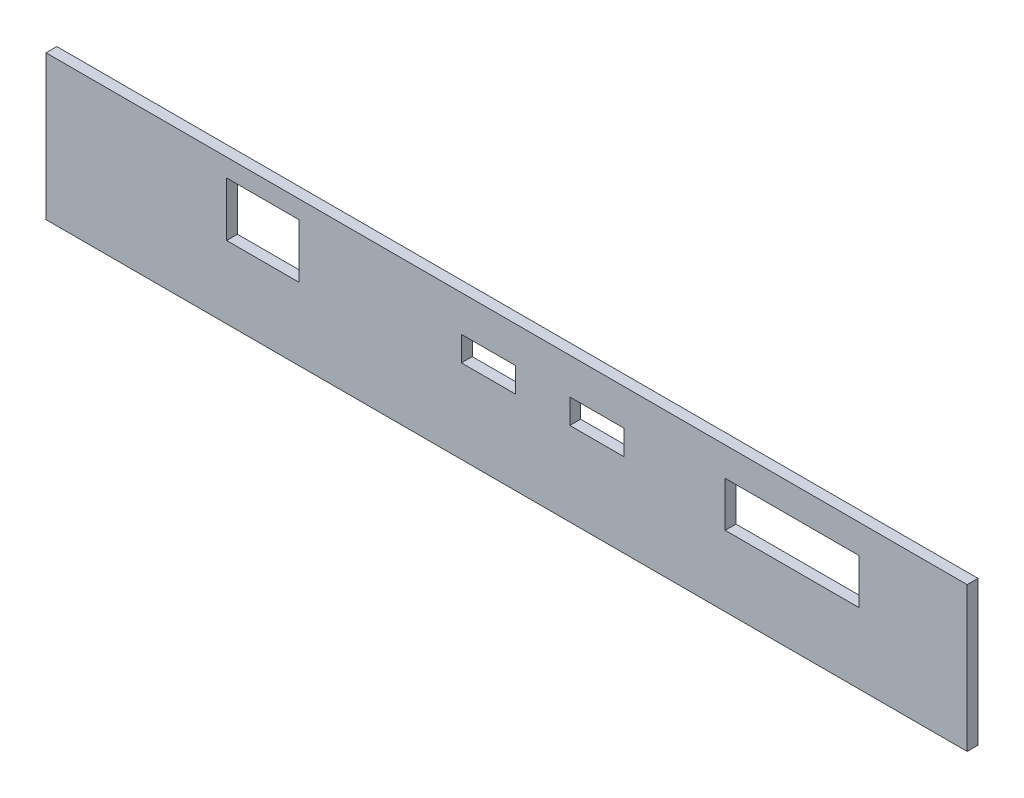
ISO-10303-21;
HEADER;
FILE_DESCRIPTION(('STEP AP214'),'2;1');
FILE_NAME('part.step','',(''),(''),'','','');
FILE_SCHEMA(('AUTOMOTIVE_DESIGN { 1 0 10303 214 1 1 1 1 }'));
ENDSEC;
DATA;
#1=APPLICATION_CONTEXT('core data for automotive mechanical design processes');
#2=APPLICATION_PROTOCOL_DEFINITION('international standard','automotive_design',2000,#1);
#3=PRODUCT_CONTEXT('',#1,'mechanical');
#4=PRODUCT('Part','Part','',(#3));
#5=PRODUCT_RELATED_PRODUCT_CATEGORY('part','',(#4));
#6=PRODUCT_DEFINITION_FORMATION('','',#4);
#7=PRODUCT_DEFINITION_CONTEXT('part definition',#1,'design');
#8=PRODUCT_DEFINITION('design','',#6,#7);
#9=PRODUCT_DEFINITION_SHAPE('','',#8);
#10=(LENGTH_UNIT() NAMED_UNIT(*) SI_UNIT(.MILLI.,.METRE.));
#11=(NAMED_UNIT(*) PLANE_ANGLE_UNIT() SI_UNIT($,.RADIAN.));
#12=(NAMED_UNIT(*) SI_UNIT($,.STERADIAN.) SOLID_ANGLE_UNIT());
#13=UNCERTAINTY_MEASURE_WITH_UNIT(LENGTH_MEASURE(1.E-05),#10,'distance_accuracy_value','');
#14=(GEOMETRIC_REPRESENTATION_CONTEXT(3) GLOBAL_UNCERTAINTY_ASSIGNED_CONTEXT((#13)) GLOBAL_UNIT_ASSIGNED_CONTEXT((#10,
#11,#12)) REPRESENTATION_CONTEXT('',''));
#15=CARTESIAN_POINT('',(0.,0.,0.));
#16=DIRECTION('',(0.,0.,1.));
#17=DIRECTION('',(1.,0.,0.));
#18=AXIS2_PLACEMENT_3D('',#15,#16,#17);
#19=CARTESIAN_POINT('',(-72.2716231344216,0.,3.));
#20=DIRECTION('',(1.,0.,0.));
#21=DIRECTION('',(0.,0.,-1.));
#22=AXIS2_PLACEMENT_3D('',#19,#20,#21);
#23=PLANE('',#22);
#24=DIRECTION('',(0.,-1.,0.));
#25=VECTOR('',#24,1.);
#26=CARTESIAN_POINT('',(-72.2716231344216,0.,0.));
#27=LINE('',#26,#25);
#28=CARTESIAN_POINT('',(-72.2716231344216,9.64684014869885,0.));
#29=VERTEX_POINT('',#28);
#30=CARTESIAN_POINT('',(-72.2716231344216,-5.35315985130115,0.));
#31=VERTEX_POINT('',#30);
#32=EDGE_CURVE('E298',#29,#31,#27,.T.);
#33=ORIENTED_EDGE('',*,*,#32,.F.);
#34=DIRECTION('',(0.,0.,-1.));
#35=VECTOR('',#34,1.);
#36=CARTESIAN_POINT('',(-72.2716231344216,9.64684014869885,3.));
#37=LINE('',#36,#35);
#38=CARTESIAN_POINT('',(-72.2716231344216,9.64684014869885,3.));
#39=VERTEX_POINT('',#38);
#40=EDGE_CURVE('E11',#39,#29,#37,.T.);
#41=ORIENTED_EDGE('',*,*,#40,.F.);
#42=DIRECTION('',(0.,-1.,0.));
#43=VECTOR('',#42,1.);
#44=CARTESIAN_POINT('',(-72.2716231344216,0.,3.));
#45=LINE('',#44,#43);
#46=CARTESIAN_POINT('',(-72.2716231344216,-5.35315985130115,3.));
#47=VERTEX_POINT('',#46);
#48=EDGE_CURVE('E191',#39,#47,#45,.T.);
#49=ORIENTED_EDGE('',*,*,#48,.T.);
#50=DIRECTION('',(0.,0.,-1.));
#51=VECTOR('',#50,1.);
#52=CARTESIAN_POINT('',(-72.2716231344216,-5.35315985130115,3.));
#53=LINE('',#52,#51);
#54=EDGE_CURVE('E53',#47,#31,#53,.T.);
#55=ORIENTED_EDGE('',*,*,#54,.T.);
#56=EDGE_LOOP('',(#33,#41,#49,#55));
#57=FACE_BOUND('',#56,.T.);
#58=ADVANCED_FACE('F34',(#57),#23,.T.);
#59=CARTESIAN_POINT('',(0.,9.64684014869885,3.));
#60=DIRECTION('',(0.,1.,0.));
#61=DIRECTION('',(0.,0.,1.));
#62=AXIS2_PLACEMENT_3D('',#59,#60,#61);
#63=PLANE('',#62);
#64=DIRECTION('',(1.,0.,0.));
#65=VECTOR('',#64,1.);
#66=CARTESIAN_POINT('',(0.,9.64684014869885,0.));
#67=LINE('',#66,#65);
#68=CARTESIAN_POINT('',(-52.2716231344216,9.64684014869885,0.));
#69=VERTEX_POINT('',#68);
#70=EDGE_CURVE('E196',#29,#69,#67,.T.);
#71=ORIENTED_EDGE('',*,*,#70,.T.);
#72=DIRECTION('',(0.,0.,-1.));
#73=VECTOR('',#72,1.);
#74=CARTESIAN_POINT('',(-52.2716231344216,9.64684014869885,3.));
#75=LINE('',#74,#73);
#76=CARTESIAN_POINT('',(-52.2716231344216,9.64684014869885,3.));
#77=VERTEX_POINT('',#76);
#78=EDGE_CURVE('E44',#77,#69,#75,.T.);
#79=ORIENTED_EDGE('',*,*,#78,.F.);
#80=DIRECTION('',(1.,0.,0.));
#81=VECTOR('',#80,1.);
#82=CARTESIAN_POINT('',(0.,9.64684014869885,3.));
#83=LINE('',#82,#81);
#84=EDGE_CURVE('E186',#39,#77,#83,.T.);
#85=ORIENTED_EDGE('',*,*,#84,.F.);
#86=ORIENTED_EDGE('',*,*,#40,.T.);
#87=EDGE_LOOP('',(#71,#79,#85,#86));
#88=FACE_BOUND('',#87,.T.);
#89=ADVANCED_FACE('F194',(#88),#63,.F.);
#90=CARTESIAN_POINT('',(-52.2716231344216,0.,3.));
#91=DIRECTION('',(1.,0.,0.));
#92=DIRECTION('',(0.,0.,-1.));
#93=AXIS2_PLACEMENT_3D('',#90,#91,#92);
#94=PLANE('',#93);
#95=DIRECTION('',(0.,-1.,0.));
#96=VECTOR('',#95,1.);
#97=CARTESIAN_POINT('',(-52.2716231344216,0.,0.));
#98=LINE('',#97,#96);
#99=CARTESIAN_POINT('',(-52.2716231344216,-5.35315985130115,0.));
#100=VERTEX_POINT('',#99);
#101=EDGE_CURVE('E301',#69,#100,#98,.T.);
#102=ORIENTED_EDGE('',*,*,#101,.T.);
#103=DIRECTION('',(0.,0.,-1.));
#104=VECTOR('',#103,1.);
#105=CARTESIAN_POINT('',(-52.2716231344216,-5.35315985130115,3.));
#106=LINE('',#105,#104);
#107=CARTESIAN_POINT('',(-52.2716231344216,-5.35315985130115,3.));
#108=VERTEX_POINT('',#107);
#109=EDGE_CURVE('E115',#108,#100,#106,.T.);
#110=ORIENTED_EDGE('',*,*,#109,.F.);
#111=DIRECTION('',(0.,-1.,0.));
#112=VECTOR('',#111,1.);
#113=CARTESIAN_POINT('',(-52.2716231344216,0.,3.));
#114=LINE('',#113,#112);
#115=EDGE_CURVE('E178',#77,#108,#114,.T.);
#116=ORIENTED_EDGE('',*,*,#115,.F.);
#117=ORIENTED_EDGE('',*,*,#78,.T.);
#118=EDGE_LOOP('',(#102,#110,#116,#117));
#119=FACE_BOUND('',#118,.T.);
#120=ADVANCED_FACE('F180',(#119),#94,.F.);
#121=CARTESIAN_POINT('',(-7.27162313442159,0.,3.));
#122=DIRECTION('',(1.,0.,0.));
#123=DIRECTION('',(0.,0.,-1.));
#124=AXIS2_PLACEMENT_3D('',#121,#122,#123);
#125=PLANE('',#124);
#126=DIRECTION('',(0.,-1.,0.));
#127=VECTOR('',#126,1.);
#128=CARTESIAN_POINT('',(-7.27162313442159,0.,0.));
#129=LINE('',#128,#127);
#130=CARTESIAN_POINT('',(-7.27162313442159,4.64684014869884,0.));
#131=VERTEX_POINT('',#130);
#132=CARTESIAN_POINT('',(-7.27162313442159,-2.19127362611296,0.));
#133=VERTEX_POINT('',#132);
#134=EDGE_CURVE('E286',#131,#133,#129,.T.);
#135=ORIENTED_EDGE('',*,*,#134,.F.);
#136=DIRECTION('',(0.,0.,-1.));
#137=VECTOR('',#136,1.);
#138=CARTESIAN_POINT('',(-7.27162313442159,4.64684014869884,3.));
#139=LINE('',#138,#137);
#140=CARTESIAN_POINT('',(-7.27162313442159,4.64684014869884,3.));
#141=VERTEX_POINT('',#140);
#142=EDGE_CURVE('E209',#141,#131,#139,.T.);
#143=ORIENTED_EDGE('',*,*,#142,.F.);
#144=DIRECTION('',(0.,-1.,0.));
#145=VECTOR('',#144,1.);
#146=CARTESIAN_POINT('',(-7.27162313442159,0.,3.));
#147=LINE('',#146,#145);
#148=CARTESIAN_POINT('',(-7.27162313442159,-2.19127362611296,3.));
#149=VERTEX_POINT('',#148);
#150=EDGE_CURVE('E336',#141,#149,#147,.T.);
#151=ORIENTED_EDGE('',*,*,#150,.T.);
#152=DIRECTION('',(0.,0.,-1.));
#153=VECTOR('',#152,1.);
#154=CARTESIAN_POINT('',(-7.27162313442159,-2.19127362611296,3.));
#155=LINE('',#154,#153);
#156=EDGE_CURVE('E201',#149,#133,#155,.T.);
#157=ORIENTED_EDGE('',*,*,#156,.T.);
#158=EDGE_LOOP('',(#135,#143,#151,#157));
#159=FACE_BOUND('',#158,.T.);
#160=ADVANCED_FACE('F383',(#159),#125,.T.);
#161=CARTESIAN_POINT('',(0.,4.64684014869884,3.));
#162=DIRECTION('',(0.,1.,0.));
#163=DIRECTION('',(0.,0.,1.));
#164=AXIS2_PLACEMENT_3D('',#161,#162,#163);
#165=PLANE('',#164);
#166=DIRECTION('',(1.,0.,0.));
#167=VECTOR('',#166,1.);
#168=CARTESIAN_POINT('',(0.,4.64684014869884,0.));
#169=LINE('',#168,#167);
#170=CARTESIAN_POINT('',(7.72837686557842,4.64684014869884,0.));
#171=VERTEX_POINT('',#170);
#172=EDGE_CURVE('E289',#131,#171,#169,.T.);
#173=ORIENTED_EDGE('',*,*,#172,.T.);
#174=DIRECTION('',(0.,0.,-1.));
#175=VECTOR('',#174,1.);
#176=CARTESIAN_POINT('',(7.72837686557842,4.64684014869884,3.));
#177=LINE('',#176,#175);
#178=CARTESIAN_POINT('',(7.72837686557842,4.64684014869884,3.));
#179=VERTEX_POINT('',#178);
#180=EDGE_CURVE('E206',#179,#171,#177,.T.);
#181=ORIENTED_EDGE('',*,*,#180,.F.);
#182=DIRECTION('',(1.,0.,0.));
#183=VECTOR('',#182,1.);
#184=CARTESIAN_POINT('',(0.,4.64684014869884,3.));
#185=LINE('',#184,#183);
#186=EDGE_CURVE('E339',#141,#179,#185,.T.);
#187=ORIENTED_EDGE('',*,*,#186,.F.);
#188=ORIENTED_EDGE('',*,*,#142,.T.);
#189=EDGE_LOOP('',(#173,#181,#187,#188));
#190=FACE_BOUND('',#189,.T.);
#191=ADVANCED_FACE('F379',(#190),#165,.F.);
#192=CARTESIAN_POINT('',(7.72837686557842,0.,3.));
#193=DIRECTION('',(1.,0.,0.));
#194=DIRECTION('',(0.,0.,-1.));
#195=AXIS2_PLACEMENT_3D('',#192,#193,#194);
#196=PLANE('',#195);
#197=DIRECTION('',(0.,-1.,0.));
#198=VECTOR('',#197,1.);
#199=CARTESIAN_POINT('',(7.72837686557842,0.,0.));
#200=LINE('',#199,#198);
#201=CARTESIAN_POINT('',(7.72837686557842,-2.19127362611296,0.));
#202=VERTEX_POINT('',#201);
#203=EDGE_CURVE('E292',#171,#202,#200,.T.);
#204=ORIENTED_EDGE('',*,*,#203,.T.);
#205=DIRECTION('',(0.,0.,-1.));
#206=VECTOR('',#205,1.);
#207=CARTESIAN_POINT('',(7.72837686557842,-2.19127362611296,3.));
#208=LINE('',#207,#206);
#209=CARTESIAN_POINT('',(7.72837686557842,-2.19127362611296,3.));
#210=VERTEX_POINT('',#209);
#211=EDGE_CURVE('E203',#210,#202,#208,.T.);
#212=ORIENTED_EDGE('',*,*,#211,.F.);
#213=DIRECTION('',(0.,-1.,0.));
#214=VECTOR('',#213,1.);
#215=CARTESIAN_POINT('',(7.72837686557842,0.,3.));
#216=LINE('',#215,#214);
#217=EDGE_CURVE('E342',#179,#210,#216,.T.);
#218=ORIENTED_EDGE('',*,*,#217,.F.);
#219=ORIENTED_EDGE('',*,*,#180,.T.);
#220=EDGE_LOOP('',(#204,#212,#218,#219));
#221=FACE_BOUND('',#220,.T.);
#222=ADVANCED_FACE('F375',(#221),#196,.F.);
#223=CARTESIAN_POINT('',(22.7283768655784,0.,3.));
#224=DIRECTION('',(1.,0.,0.));
#225=DIRECTION('',(0.,0.,-1.));
#226=AXIS2_PLACEMENT_3D('',#223,#224,#225);
#227=PLANE('',#226);
#228=DIRECTION('',(0.,-1.,0.));
#229=VECTOR('',#228,1.);
#230=CARTESIAN_POINT('',(22.7283768655784,0.,0.));
#231=LINE('',#230,#229);
#232=CARTESIAN_POINT('',(22.7283768655784,4.64684014869884,0.));
#233=VERTEX_POINT('',#232);
#234=CARTESIAN_POINT('',(22.7283768655784,-2.19127362611299,0.));
#235=VERTEX_POINT('',#234);
#236=EDGE_CURVE('E274',#233,#235,#231,.T.);
#237=ORIENTED_EDGE('',*,*,#236,.F.);
#238=DIRECTION('',(0.,0.,-1.));
#239=VECTOR('',#238,1.);
#240=CARTESIAN_POINT('',(22.7283768655784,4.64684014869884,3.));
#241=LINE('',#240,#239);
#242=CARTESIAN_POINT('',(22.7283768655784,4.64684014869884,3.));
#243=VERTEX_POINT('',#242);
#244=EDGE_CURVE('E204',#243,#233,#241,.T.);
#245=ORIENTED_EDGE('',*,*,#244,.F.);
#246=DIRECTION('',(0.,-1.,0.));
#247=VECTOR('',#246,1.);
#248=CARTESIAN_POINT('',(22.7283768655784,0.,3.));
#249=LINE('',#248,#247);
#250=CARTESIAN_POINT('',(22.7283768655784,-2.19127362611299,3.));
#251=VERTEX_POINT('',#250);
#252=EDGE_CURVE('E325',#243,#251,#249,.T.);
#253=ORIENTED_EDGE('',*,*,#252,.T.);
#254=DIRECTION('',(0.,0.,-1.));
#255=VECTOR('',#254,1.);
#256=CARTESIAN_POINT('',(22.7283768655784,-2.19127362611299,3.));
#257=LINE('',#256,#255);
#258=EDGE_CURVE('E211',#251,#235,#257,.T.);
#259=ORIENTED_EDGE('',*,*,#258,.T.);
#260=EDGE_LOOP('',(#237,#245,#253,#259));
#261=FACE_BOUND('',#260,.T.);
#262=ADVANCED_FACE('F378',(#261),#227,.T.);
#263=CARTESIAN_POINT('',(0.,4.64684014869884,3.));
#264=DIRECTION('',(0.,1.,0.));
#265=DIRECTION('',(0.,0.,1.));
#266=AXIS2_PLACEMENT_3D('',#263,#264,#265);
#267=PLANE('',#266);
#268=DIRECTION('',(1.,0.,0.));
#269=VECTOR('',#268,1.);
#270=CARTESIAN_POINT('',(0.,4.64684014869884,0.));
#271=LINE('',#270,#269);
#272=CARTESIAN_POINT('',(37.7283768655784,4.64684014869884,0.));
#273=VERTEX_POINT('',#272);
#274=EDGE_CURVE('E277',#233,#273,#271,.T.);
#275=ORIENTED_EDGE('',*,*,#274,.T.);
#276=DIRECTION('',(0.,0.,-1.));
#277=VECTOR('',#276,1.);
#278=CARTESIAN_POINT('',(37.7283768655784,4.64684014869884,3.));
#279=LINE('',#278,#277);
#280=CARTESIAN_POINT('',(37.7283768655784,4.64684014869884,3.));
#281=VERTEX_POINT('',#280);
#282=EDGE_CURVE('E217',#281,#273,#279,.T.);
#283=ORIENTED_EDGE('',*,*,#282,.F.);
#284=DIRECTION('',(1.,0.,0.));
#285=VECTOR('',#284,1.);
#286=CARTESIAN_POINT('',(0.,4.64684014869884,3.));
#287=LINE('',#286,#285);
#288=EDGE_CURVE('E328',#243,#281,#287,.T.);
#289=ORIENTED_EDGE('',*,*,#288,.F.);
#290=ORIENTED_EDGE('',*,*,#244,.T.);
#291=EDGE_LOOP('',(#275,#283,#289,#290));
#292=FACE_BOUND('',#291,.T.);
#293=ADVANCED_FACE('F395',(#292),#267,.F.);
#294=CARTESIAN_POINT('',(37.7283768655784,0.,3.));
#295=DIRECTION('',(1.,0.,0.));
#296=DIRECTION('',(0.,0.,-1.));
#297=AXIS2_PLACEMENT_3D('',#294,#295,#296);
#298=PLANE('',#297);
#299=DIRECTION('',(0.,-1.,0.));
#300=VECTOR('',#299,1.);
#301=CARTESIAN_POINT('',(37.7283768655784,0.,0.));
#302=LINE('',#301,#300);
#303=CARTESIAN_POINT('',(37.7283768655784,-2.19127362611299,0.));
#304=VERTEX_POINT('',#303);
#305=EDGE_CURVE('E280',#273,#304,#302,.T.);
#306=ORIENTED_EDGE('',*,*,#305,.T.);
#307=DIRECTION('',(0.,0.,-1.));
#308=VECTOR('',#307,1.);
#309=CARTESIAN_POINT('',(37.7283768655784,-2.19127362611299,3.));
#310=LINE('',#309,#308);
#311=CARTESIAN_POINT('',(37.7283768655784,-2.19127362611299,3.));
#312=VERTEX_POINT('',#311);
#313=EDGE_CURVE('E213',#312,#304,#310,.T.);
#314=ORIENTED_EDGE('',*,*,#313,.F.);
#315=DIRECTION('',(0.,-1.,0.));
#316=VECTOR('',#315,1.);
#317=CARTESIAN_POINT('',(37.7283768655784,0.,3.));
#318=LINE('',#317,#316);
#319=EDGE_CURVE('E331',#281,#312,#318,.T.);
#320=ORIENTED_EDGE('',*,*,#319,.F.);
#321=ORIENTED_EDGE('',*,*,#282,.T.);
#322=EDGE_LOOP('',(#306,#314,#320,#321));
#323=FACE_BOUND('',#322,.T.);
#324=ADVANCED_FACE('F391',(#323),#298,.F.);
#325=CARTESIAN_POINT('',(65.7283768655784,0.,3.));
#326=DIRECTION('',(1.,0.,0.));
#327=DIRECTION('',(0.,0.,-1.));
#328=AXIS2_PLACEMENT_3D('',#325,#326,#327);
#329=PLANE('',#328);
#330=DIRECTION('',(0.,-1.,0.));
#331=VECTOR('',#330,1.);
#332=CARTESIAN_POINT('',(65.7283768655784,0.,0.));
#333=LINE('',#332,#331);
#334=CARTESIAN_POINT('',(65.7283768655784,6.64684014869885,0.));
#335=VERTEX_POINT('',#334);
#336=CARTESIAN_POINT('',(65.7283768655784,-5.83253031361794,0.));
#337=VERTEX_POINT('',#336);
#338=EDGE_CURVE('E262',#335,#337,#333,.T.);
#339=ORIENTED_EDGE('',*,*,#338,.F.);
#340=DIRECTION('',(0.,0.,-1.));
#341=VECTOR('',#340,1.);
#342=CARTESIAN_POINT('',(65.7283768655784,6.64684014869885,3.));
#343=LINE('',#342,#341);
#344=CARTESIAN_POINT('',(65.7283768655784,6.64684014869885,3.));
#345=VERTEX_POINT('',#344);
#346=EDGE_CURVE('E214',#345,#335,#343,.T.);
#347=ORIENTED_EDGE('',*,*,#346,.F.);
#348=DIRECTION('',(0.,-1.,0.));
#349=VECTOR('',#348,1.);
#350=CARTESIAN_POINT('',(65.7283768655784,0.,3.));
#351=LINE('',#350,#349);
#352=CARTESIAN_POINT('',(65.7283768655784,-5.83253031361794,3.));
#353=VERTEX_POINT('',#352);
#354=EDGE_CURVE('E314',#345,#353,#351,.T.);
#355=ORIENTED_EDGE('',*,*,#354,.T.);
#356=DIRECTION('',(0.,0.,-1.));
#357=VECTOR('',#356,1.);
#358=CARTESIAN_POINT('',(65.7283768655784,-5.83253031361794,3.));
#359=LINE('',#358,#357);
#360=EDGE_CURVE('E221',#353,#337,#359,.T.);
#361=ORIENTED_EDGE('',*,*,#360,.T.);
#362=EDGE_LOOP('',(#339,#347,#355,#361));
#363=FACE_BOUND('',#362,.T.);
#364=ADVANCED_FACE('F394',(#363),#329,.T.);
#365=CARTESIAN_POINT('',(0.,6.64684014869885,3.));
#366=DIRECTION('',(0.,1.,0.));
#367=DIRECTION('',(0.,0.,1.));
#368=AXIS2_PLACEMENT_3D('',#365,#366,#367);
#369=PLANE('',#368);
#370=DIRECTION('',(1.,0.,0.));
#371=VECTOR('',#370,1.);
#372=CARTESIAN_POINT('',(0.,6.64684014869885,0.));
#373=LINE('',#372,#371);
#374=CARTESIAN_POINT('',(102.728376865578,6.64684014869885,0.));
#375=VERTEX_POINT('',#374);
#376=EDGE_CURVE('E265',#335,#375,#373,.T.);
#377=ORIENTED_EDGE('',*,*,#376,.T.);
#378=DIRECTION('',(0.,0.,-1.));
#379=VECTOR('',#378,1.);
#380=CARTESIAN_POINT('',(102.728376865578,6.64684014869885,3.));
#381=LINE('',#380,#379);
#382=CARTESIAN_POINT('',(102.728376865578,6.64684014869885,3.));
#383=VERTEX_POINT('',#382);
#384=EDGE_CURVE('E226',#383,#375,#381,.T.);
#385=ORIENTED_EDGE('',*,*,#384,.F.);
#386=DIRECTION('',(1.,0.,0.));
#387=VECTOR('',#386,1.);
#388=CARTESIAN_POINT('',(0.,6.64684014869885,3.));
#389=LINE('',#388,#387);
#390=EDGE_CURVE('E317',#345,#383,#389,.T.);
#391=ORIENTED_EDGE('',*,*,#390,.F.);
#392=ORIENTED_EDGE('',*,*,#346,.T.);
#393=EDGE_LOOP('',(#377,#385,#391,#392));
#394=FACE_BOUND('',#393,.T.);
#395=ADVANCED_FACE('F409',(#394),#369,.F.);
#396=CARTESIAN_POINT('',(102.728376865578,0.,3.));
#397=DIRECTION('',(1.,0.,0.));
#398=DIRECTION('',(0.,0.,-1.));
#399=AXIS2_PLACEMENT_3D('',#396,#397,#398);
#400=PLANE('',#399);
#401=DIRECTION('',(0.,-1.,0.));
#402=VECTOR('',#401,1.);
#403=CARTESIAN_POINT('',(102.728376865578,0.,0.));
#404=LINE('',#403,#402);
#405=CARTESIAN_POINT('',(102.728376865578,-5.83253031361793,0.));
#406=VERTEX_POINT('',#405);
#407=EDGE_CURVE('E268',#375,#406,#404,.T.);
#408=ORIENTED_EDGE('',*,*,#407,.T.);
#409=DIRECTION('',(0.,0.,-1.));
#410=VECTOR('',#409,1.);
#411=CARTESIAN_POINT('',(102.728376865578,-5.83253031361793,3.));
#412=LINE('',#411,#410);
#413=CARTESIAN_POINT('',(102.728376865578,-5.83253031361793,3.));
#414=VERTEX_POINT('',#413);
#415=EDGE_CURVE('E223',#414,#406,#412,.T.);
#416=ORIENTED_EDGE('',*,*,#415,.F.);
#417=DIRECTION('',(0.,-1.,0.));
#418=VECTOR('',#417,1.);
#419=CARTESIAN_POINT('',(102.728376865578,0.,3.));
#420=LINE('',#419,#418);
#421=EDGE_CURVE('E320',#383,#414,#420,.T.);
#422=ORIENTED_EDGE('',*,*,#421,.F.);
#423=ORIENTED_EDGE('',*,*,#384,.T.);
#424=EDGE_LOOP('',(#408,#416,#422,#423));
#425=FACE_BOUND('',#424,.T.);
#426=ADVANCED_FACE('F406',(#425),#400,.F.);
#427=CARTESIAN_POINT('',(132.728376865578,0.,3.));
#428=DIRECTION('',(1.,0.,0.));
#429=DIRECTION('',(0.,1.,0.));
#430=AXIS2_PLACEMENT_3D('',#427,#428,#429);
#431=PLANE('',#430);
#432=DIRECTION('',(0.,-1.,0.));
#433=VECTOR('',#432,1.);
#434=CARTESIAN_POINT('',(132.728376865578,0.,0.));
#435=LINE('',#434,#433);
#436=CARTESIAN_POINT('',(132.728376865578,14.6468401486988,0.));
#437=VERTEX_POINT('',#436);
#438=CARTESIAN_POINT('',(132.728376865578,-25.3531598513012,0.));
#439=VERTEX_POINT('',#438);
#440=EDGE_CURVE('E247',#437,#439,#435,.T.);
#441=ORIENTED_EDGE('',*,*,#440,.F.);
#442=DIRECTION('',(0.,0.,-1.));
#443=VECTOR('',#442,1.);
#444=CARTESIAN_POINT('',(132.728376865578,14.6468401486988,3.));
#445=LINE('',#444,#443);
#446=CARTESIAN_POINT('',(132.728376865578,14.6468401486988,3.));
#447=VERTEX_POINT('',#446);
#448=EDGE_CURVE('E38',#447,#437,#445,.T.);
#449=ORIENTED_EDGE('',*,*,#448,.F.);
#450=DIRECTION('',(0.,-1.,0.));
#451=VECTOR('',#450,1.);
#452=CARTESIAN_POINT('',(132.728376865578,0.,3.));
#453=LINE('',#452,#451);
#454=CARTESIAN_POINT('',(132.728376865578,-25.3531598513012,3.));
#455=VERTEX_POINT('',#454);
#456=EDGE_CURVE('E305',#447,#455,#453,.T.);
#457=ORIENTED_EDGE('',*,*,#456,.T.);
#458=DIRECTION('',(0.,0.,-1.));
#459=VECTOR('',#458,1.);
#460=CARTESIAN_POINT('',(132.728376865578,-25.3531598513012,3.));
#461=LINE('',#460,#459);
#462=EDGE_CURVE('E230',#455,#439,#461,.T.);
#463=ORIENTED_EDGE('',*,*,#462,.T.);
#464=EDGE_LOOP('',(#441,#449,#457,#463));
#465=FACE_BOUND('',#464,.T.);
#466=ADVANCED_FACE('F36',(#465),#431,.T.);
#467=CARTESIAN_POINT('',(0.,14.6468401486988,3.));
#468=DIRECTION('',(0.,1.,0.));
#469=DIRECTION('',(0.,0.,1.));
#470=AXIS2_PLACEMENT_3D('',#467,#468,#469);
#471=PLANE('',#470);
#472=DIRECTION('',(1.,0.,0.));
#473=VECTOR('',#472,1.);
#474=CARTESIAN_POINT('',(0.,14.6468401486988,0.));
#475=LINE('',#474,#473);
#476=CARTESIAN_POINT('',(-122.271623134422,14.6468401486988,0.));
#477=VERTEX_POINT('',#476);
#478=EDGE_CURVE('E243',#477,#437,#475,.T.);
#479=ORIENTED_EDGE('',*,*,#478,.F.);
#480=DIRECTION('',(0.,0.,-1.));
#481=VECTOR('',#480,1.);
#482=CARTESIAN_POINT('',(-122.271623134422,14.6468401486988,3.));
#483=LINE('',#482,#481);
#484=CARTESIAN_POINT('',(-122.271623134422,14.6468401486988,3.));
#485=VERTEX_POINT('',#484);
#486=EDGE_CURVE('E234',#485,#477,#483,.T.);
#487=ORIENTED_EDGE('',*,*,#486,.F.);
#488=DIRECTION('',(1.,0.,0.));
#489=VECTOR('',#488,1.);
#490=CARTESIAN_POINT('',(0.,14.6468401486988,3.));
#491=LINE('',#490,#489);
#492=EDGE_CURVE('E245',#485,#447,#491,.T.);
#493=ORIENTED_EDGE('',*,*,#492,.T.);
#494=ORIENTED_EDGE('',*,*,#448,.T.);
#495=EDGE_LOOP('',(#479,#487,#493,#494));
#496=FACE_BOUND('',#495,.T.);
#497=ADVANCED_FACE('F241',(#496),#471,.T.);
#498=CARTESIAN_POINT('',(-122.271623134422,0.,3.));
#499=DIRECTION('',(1.,0.,0.));
#500=DIRECTION('',(0.,1.,0.));
#501=AXIS2_PLACEMENT_3D('',#498,#499,#500);
#502=PLANE('',#501);
#503=DIRECTION('',(0.,-1.,0.));
#504=VECTOR('',#503,1.);
#505=CARTESIAN_POINT('',(-122.271623134422,0.,0.));
#506=LINE('',#505,#504);
#507=CARTESIAN_POINT('',(-122.271623134422,-25.3531598513012,0.));
#508=VERTEX_POINT('',#507);
#509=EDGE_CURVE('E255',#477,#508,#506,.T.);
#510=ORIENTED_EDGE('',*,*,#509,.T.);
#511=DIRECTION('',(0.,0.,-1.));
#512=VECTOR('',#511,1.);
#513=CARTESIAN_POINT('',(-122.271623134422,-25.3531598513012,3.));
#514=LINE('',#513,#512);
#515=CARTESIAN_POINT('',(-122.271623134422,-25.3531598513012,3.));
#516=VERTEX_POINT('',#515);
#517=EDGE_CURVE('E232',#516,#508,#514,.T.);
#518=ORIENTED_EDGE('',*,*,#517,.F.);
#519=DIRECTION('',(0.,-1.,0.));
#520=VECTOR('',#519,1.);
#521=CARTESIAN_POINT('',(-122.271623134422,0.,3.));
#522=LINE('',#521,#520);
#523=EDGE_CURVE('E308',#485,#516,#522,.T.);
#524=ORIENTED_EDGE('',*,*,#523,.F.);
#525=ORIENTED_EDGE('',*,*,#486,.T.);
#526=EDGE_LOOP('',(#510,#518,#524,#525));
#527=FACE_BOUND('',#526,.T.);
#528=ADVANCED_FACE('F373',(#527),#502,.F.);
#529=CARTESIAN_POINT('',(0.,-2.19127362611296,3.));
#530=DIRECTION('',(0.,1.,0.));
#531=DIRECTION('',(0.,0.,1.));
#532=AXIS2_PLACEMENT_3D('',#529,#530,#531);
#533=PLANE('',#532);
#534=DIRECTION('',(1.,0.,0.));
#535=VECTOR('',#534,1.);
#536=CARTESIAN_POINT('',(0.,-2.19127362611296,0.));
#537=LINE('',#536,#535);
#538=EDGE_CURVE('E295',#133,#202,#537,.T.);
#539=ORIENTED_EDGE('',*,*,#538,.F.);
#540=ORIENTED_EDGE('',*,*,#156,.F.);
#541=DIRECTION('',(1.,0.,0.));
#542=VECTOR('',#541,1.);
#543=CARTESIAN_POINT('',(0.,-2.19127362611296,3.));
#544=LINE('',#543,#542);
#545=EDGE_CURVE('E344',#149,#210,#544,.T.);
#546=ORIENTED_EDGE('',*,*,#545,.T.);
#547=ORIENTED_EDGE('',*,*,#211,.T.);
#548=EDGE_LOOP('',(#539,#540,#546,#547));
#549=FACE_BOUND('',#548,.T.);
#550=ADVANCED_FACE('F369',(#549),#533,.T.);
#551=CARTESIAN_POINT('',(0.,-2.191273626113,3.));
#552=DIRECTION('',(0.,-1.,0.));
#553=DIRECTION('',(1.,0.,0.));
#554=AXIS2_PLACEMENT_3D('',#551,#552,#553);
#555=PLANE('',#554);
#556=DIRECTION('',(-1.,0.,0.));
#557=VECTOR('',#556,1.);
#558=CARTESIAN_POINT('',(0.,-2.191273626113,0.));
#559=LINE('',#558,#557);
#560=EDGE_CURVE('E283',#304,#235,#559,.T.);
#561=ORIENTED_EDGE('',*,*,#560,.T.);
#562=ORIENTED_EDGE('',*,*,#258,.F.);
#563=DIRECTION('',(-1.,0.,0.));
#564=VECTOR('',#563,1.);
#565=CARTESIAN_POINT('',(0.,-2.191273626113,3.));
#566=LINE('',#565,#564);
#567=EDGE_CURVE('E334',#312,#251,#566,.T.);
#568=ORIENTED_EDGE('',*,*,#567,.F.);
#569=ORIENTED_EDGE('',*,*,#313,.T.);
#570=EDGE_LOOP('',(#561,#562,#568,#569));
#571=FACE_BOUND('',#570,.T.);
#572=ADVANCED_FACE('F372',(#571),#555,.F.);
#573=CARTESIAN_POINT('',(0.,-5.83253031361795,3.));
#574=DIRECTION('',(0.,-1.,0.));
#575=DIRECTION('',(1.,0.,0.));
#576=AXIS2_PLACEMENT_3D('',#573,#574,#575);
#577=PLANE('',#576);
#578=DIRECTION('',(-1.,0.,0.));
#579=VECTOR('',#578,1.);
#580=CARTESIAN_POINT('',(0.,-5.83253031361795,0.));
#581=LINE('',#580,#579);
#582=EDGE_CURVE('E271',#406,#337,#581,.T.);
#583=ORIENTED_EDGE('',*,*,#582,.T.);
#584=ORIENTED_EDGE('',*,*,#360,.F.);
#585=DIRECTION('',(-1.,0.,0.));
#586=VECTOR('',#585,1.);
#587=CARTESIAN_POINT('',(0.,-5.83253031361795,3.));
#588=LINE('',#587,#586);
#589=EDGE_CURVE('E323',#414,#353,#588,.T.);
#590=ORIENTED_EDGE('',*,*,#589,.F.);
#591=ORIENTED_EDGE('',*,*,#415,.T.);
#592=EDGE_LOOP('',(#583,#584,#590,#591));
#593=FACE_BOUND('',#592,.T.);
#594=ADVANCED_FACE('F357',(#593),#577,.F.);
#595=CARTESIAN_POINT('',(0.,-25.3531598513012,3.));
#596=DIRECTION('',(0.,1.,0.));
#597=DIRECTION('',(0.,0.,1.));
#598=AXIS2_PLACEMENT_3D('',#595,#596,#597);
#599=PLANE('',#598);
#600=DIRECTION('',(1.,0.,0.));
#601=VECTOR('',#600,1.);
#602=CARTESIAN_POINT('',(0.,-25.3531598513012,0.));
#603=LINE('',#602,#601);
#604=EDGE_CURVE('E257',#508,#439,#603,.T.);
#605=ORIENTED_EDGE('',*,*,#604,.T.);
#606=ORIENTED_EDGE('',*,*,#462,.F.);
#607=DIRECTION('',(1.,0.,0.));
#608=VECTOR('',#607,1.);
#609=CARTESIAN_POINT('',(0.,-25.3531598513012,3.));
#610=LINE('',#609,#608);
#611=EDGE_CURVE('E312',#516,#455,#610,.T.);
#612=ORIENTED_EDGE('',*,*,#611,.F.);
#613=ORIENTED_EDGE('',*,*,#517,.T.);
#614=EDGE_LOOP('',(#605,#606,#612,#613));
#615=FACE_BOUND('',#614,.T.);
#616=ADVANCED_FACE('F349',(#615),#599,.F.);
#617=CARTESIAN_POINT('',(0.,-5.35315985130115,3.));
#618=DIRECTION('',(0.,1.,0.));
#619=DIRECTION('',(0.,0.,1.));
#620=AXIS2_PLACEMENT_3D('',#617,#618,#619);
#621=PLANE('',#620);
#622=DIRECTION('',(1.,0.,0.));
#623=VECTOR('',#622,1.);
#624=CARTESIAN_POINT('',(0.,-5.35315985130115,0.));
#625=LINE('',#624,#623);
#626=EDGE_CURVE('E303',#31,#100,#625,.T.);
#627=ORIENTED_EDGE('',*,*,#626,.F.);
#628=ORIENTED_EDGE('',*,*,#54,.F.);
#629=DIRECTION('',(1.,0.,0.));
#630=VECTOR('',#629,1.);
#631=CARTESIAN_POINT('',(0.,-5.35315985130115,3.));
#632=LINE('',#631,#630);
#633=EDGE_CURVE('E185',#47,#108,#632,.T.);
#634=ORIENTED_EDGE('',*,*,#633,.T.);
#635=ORIENTED_EDGE('',*,*,#109,.T.);
#636=EDGE_LOOP('',(#627,#628,#634,#635));
#637=FACE_BOUND('',#636,.T.);
#638=ADVANCED_FACE('F347',(#637),#621,.T.);
#639=CARTESIAN_POINT('',(0.,0.,3.));
#640=DIRECTION('',(0.,0.,1.));
#641=DIRECTION('',(1.,0.,0.));
#642=AXIS2_PLACEMENT_3D('',#639,#640,#641);
#643=PLANE('',#642);
#644=ORIENTED_EDGE('',*,*,#456,.F.);
#645=ORIENTED_EDGE('',*,*,#492,.F.);
#646=ORIENTED_EDGE('',*,*,#523,.T.);
#647=ORIENTED_EDGE('',*,*,#611,.T.);
#648=EDGE_LOOP('',(#644,#645,#646,#647));
#649=FACE_BOUND('',#648,.T.);
#650=ORIENTED_EDGE('',*,*,#354,.F.);
#651=ORIENTED_EDGE('',*,*,#390,.T.);
#652=ORIENTED_EDGE('',*,*,#421,.T.);
#653=ORIENTED_EDGE('',*,*,#589,.T.);
#654=EDGE_LOOP('',(#650,#651,#652,#653));
#655=FACE_BOUND('',#654,.T.);
#656=ORIENTED_EDGE('',*,*,#252,.F.);
#657=ORIENTED_EDGE('',*,*,#288,.T.);
#658=ORIENTED_EDGE('',*,*,#319,.T.);
#659=ORIENTED_EDGE('',*,*,#567,.T.);
#660=EDGE_LOOP('',(#656,#657,#658,#659));
#661=FACE_BOUND('',#660,.T.);
#662=ORIENTED_EDGE('',*,*,#150,.F.);
#663=ORIENTED_EDGE('',*,*,#186,.T.);
#664=ORIENTED_EDGE('',*,*,#217,.T.);
#665=ORIENTED_EDGE('',*,*,#545,.F.);
#666=EDGE_LOOP('',(#662,#663,#664,#665));
#667=FACE_BOUND('',#666,.T.);
#668=ORIENTED_EDGE('',*,*,#48,.F.);
#669=ORIENTED_EDGE('',*,*,#84,.T.);
#670=ORIENTED_EDGE('',*,*,#115,.T.);
#671=ORIENTED_EDGE('',*,*,#633,.F.);
#672=EDGE_LOOP('',(#668,#669,#670,#671));
#673=FACE_BOUND('',#672,.T.);
#674=ADVANCED_FACE('F190',(#649,#655,#661,#667,#673),#643,.T.);
#675=CARTESIAN_POINT('',(0.,0.,0.));
#676=DIRECTION('',(0.,0.,1.));
#677=DIRECTION('',(1.,0.,0.));
#678=AXIS2_PLACEMENT_3D('',#675,#676,#677);
#679=PLANE('',#678);
#680=ORIENTED_EDGE('',*,*,#440,.T.);
#681=ORIENTED_EDGE('',*,*,#604,.F.);
#682=ORIENTED_EDGE('',*,*,#509,.F.);
#683=ORIENTED_EDGE('',*,*,#478,.T.);
#684=EDGE_LOOP('',(#680,#681,#682,#683));
#685=FACE_BOUND('',#684,.T.);
#686=ORIENTED_EDGE('',*,*,#338,.T.);
#687=ORIENTED_EDGE('',*,*,#582,.F.);
#688=ORIENTED_EDGE('',*,*,#407,.F.);
#689=ORIENTED_EDGE('',*,*,#376,.F.);
#690=EDGE_LOOP('',(#686,#687,#688,#689));
#691=FACE_BOUND('',#690,.T.);
#692=ORIENTED_EDGE('',*,*,#236,.T.);
#693=ORIENTED_EDGE('',*,*,#560,.F.);
#694=ORIENTED_EDGE('',*,*,#305,.F.);
#695=ORIENTED_EDGE('',*,*,#274,.F.);
#696=EDGE_LOOP('',(#692,#693,#694,#695));
#697=FACE_BOUND('',#696,.T.);
#698=ORIENTED_EDGE('',*,*,#134,.T.);
#699=ORIENTED_EDGE('',*,*,#538,.T.);
#700=ORIENTED_EDGE('',*,*,#203,.F.);
#701=ORIENTED_EDGE('',*,*,#172,.F.);
#702=EDGE_LOOP('',(#698,#699,#700,#701));
#703=FACE_BOUND('',#702,.T.);
#704=ORIENTED_EDGE('',*,*,#32,.T.);
#705=ORIENTED_EDGE('',*,*,#626,.T.);
#706=ORIENTED_EDGE('',*,*,#101,.F.);
#707=ORIENTED_EDGE('',*,*,#70,.F.);
#708=EDGE_LOOP('',(#704,#705,#706,#707));
#709=FACE_BOUND('',#708,.T.);
#710=ADVANCED_FACE('F253',(#685,#691,#697,#703,#709),#679,.F.);
#711=CLOSED_SHELL('',(#58,#89,#120,#160,#191,#222,#262,#293,#324,#364,#395,#426,#466,#497,#528,
#550,#572,#594,#616,#638,#674,#710));
#712=MANIFOLD_SOLID_BREP('B2',#711);
#713=ADVANCED_BREP_SHAPE_REPRESENTATION('',(#18,#712),#14);
#714=SHAPE_DEFINITION_REPRESENTATION(#9,#713);
ENDSEC;
END-ISO-10303-21;
